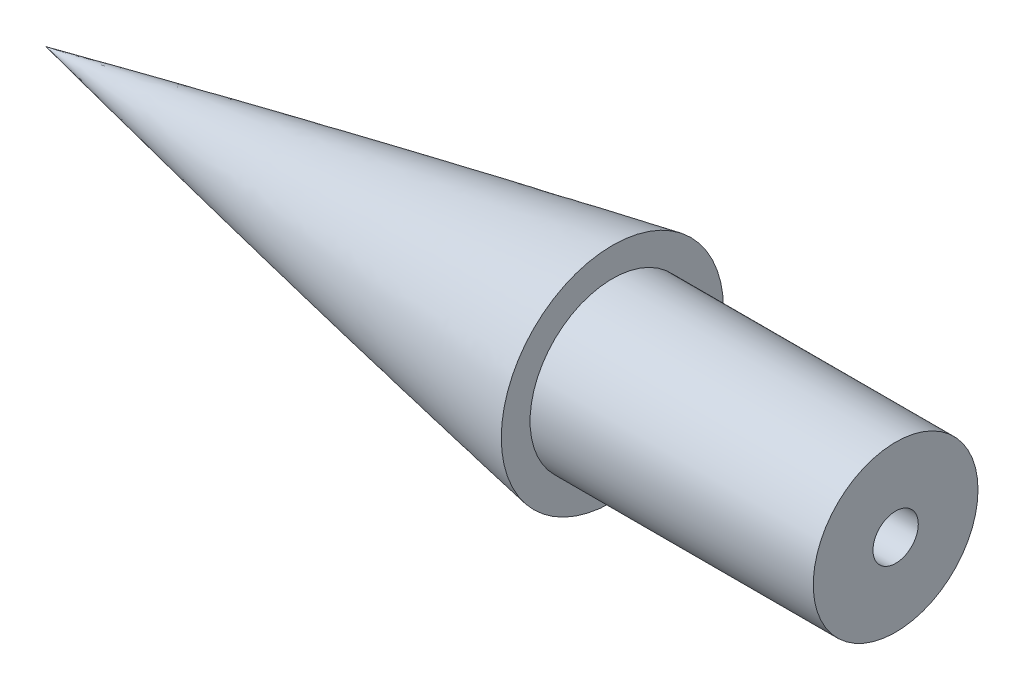
ISO-10303-21;
HEADER;
FILE_DESCRIPTION(('STEP AP214'),'2;1');
FILE_NAME('part.step','',(''),(''),'','','');
FILE_SCHEMA(('AUTOMOTIVE_DESIGN { 1 0 10303 214 1 1 1 1 }'));
ENDSEC;
DATA;
#1=APPLICATION_CONTEXT('core data for automotive mechanical design processes');
#2=APPLICATION_PROTOCOL_DEFINITION('international standard','automotive_design',2000,#1);
#3=PRODUCT_CONTEXT('',#1,'mechanical');
#4=PRODUCT('Part','Part','',(#3));
#5=PRODUCT_RELATED_PRODUCT_CATEGORY('part','',(#4));
#6=PRODUCT_DEFINITION_FORMATION('','',#4);
#7=PRODUCT_DEFINITION_CONTEXT('part definition',#1,'design');
#8=PRODUCT_DEFINITION('design','',#6,#7);
#9=PRODUCT_DEFINITION_SHAPE('','',#8);
#10=(LENGTH_UNIT() NAMED_UNIT(*) SI_UNIT(.MILLI.,.METRE.));
#11=(NAMED_UNIT(*) PLANE_ANGLE_UNIT() SI_UNIT($,.RADIAN.));
#12=(NAMED_UNIT(*) SI_UNIT($,.STERADIAN.) SOLID_ANGLE_UNIT());
#13=UNCERTAINTY_MEASURE_WITH_UNIT(LENGTH_MEASURE(1.E-05),#10,'distance_accuracy_value','');
#14=(GEOMETRIC_REPRESENTATION_CONTEXT(3) GLOBAL_UNCERTAINTY_ASSIGNED_CONTEXT((#13)) GLOBAL_UNIT_ASSIGNED_CONTEXT((#10,
#11,#12)) REPRESENTATION_CONTEXT('',''));
#15=CARTESIAN_POINT('',(0.,0.,0.));
#16=DIRECTION('',(0.,0.,1.));
#17=DIRECTION('',(1.,0.,0.));
#18=AXIS2_PLACEMENT_3D('',#15,#16,#17);
#19=CARTESIAN_POINT('',(0.,3557.29676158737,0.));
#20=DIRECTION('',(1.,0.,0.));
#21=DIRECTION('',(0.,0.,-1.));
#22=AXIS2_PLACEMENT_3D('',#19,#20,#21);
#23=CYLINDRICAL_SURFACE('',#22,14.5417356015258);
#24=CARTESIAN_POINT('',(-599.999999999507,3557.29676158737,0.));
#25=DIRECTION('',(1.,0.,0.));
#26=DIRECTION('',(0.,0.,-1.));
#27=AXIS2_PLACEMENT_3D('',#24,#25,#26);
#28=CIRCLE('',#27,14.5417356015258);
#29=CARTESIAN_POINT('',(-599.999999999507,3557.29676158737,-14.5417356015258));
#30=VERTEX_POINT('',#29);
#31=EDGE_CURVE('E63',#30,#30,#28,.T.);
#32=ORIENTED_EDGE('',*,*,#31,.F.);
#33=EDGE_LOOP('',(#32));
#34=FACE_BOUND('',#33,.T.);
#35=CARTESIAN_POINT('',(-649.999999999507,3557.29676158737,0.));
#36=DIRECTION('',(1.,0.,0.));
#37=DIRECTION('',(0.,0.,-1.));
#38=AXIS2_PLACEMENT_3D('',#35,#36,#37);
#39=CIRCLE('',#38,14.5417356015258);
#40=CARTESIAN_POINT('',(-649.999999999507,3557.29676158737,-14.5417356015258));
#41=VERTEX_POINT('',#40);
#42=EDGE_CURVE('E11',#41,#41,#39,.T.);
#43=ORIENTED_EDGE('',*,*,#42,.T.);
#44=EDGE_LOOP('',(#43));
#45=FACE_BOUND('',#44,.T.);
#46=ADVANCED_FACE('F43',(#34,#45),#23,.T.);
#47=CARTESIAN_POINT('',(-649.999999999507,0.,0.));
#48=DIRECTION('',(-1.,0.,0.));
#49=DIRECTION('',(0.,0.,1.));
#50=AXIS2_PLACEMENT_3D('',#47,#48,#49);
#51=PLANE('',#50);
#52=ORIENTED_EDGE('',*,*,#42,.F.);
#53=EDGE_LOOP('',(#52));
#54=FACE_BOUND('',#53,.T.);
#55=CARTESIAN_POINT('',(-649.999999999507,3557.29676158737,0.));
#56=DIRECTION('',(1.,0.,0.));
#57=DIRECTION('',(0.,0.,-1.));
#58=AXIS2_PLACEMENT_3D('',#55,#56,#57);
#59=CIRCLE('',#58,19.6237365507463);
#60=CARTESIAN_POINT('',(-649.999999999507,3557.29676158737,-19.6237365507463));
#61=VERTEX_POINT('',#60);
#62=EDGE_CURVE('E50',#61,#61,#59,.T.);
#63=ORIENTED_EDGE('',*,*,#62,.T.);
#64=EDGE_LOOP('',(#63));
#65=FACE_BOUND('',#64,.T.);
#66=ADVANCED_FACE('F57',(#54,#65),#51,.F.);
#67=CARTESIAN_POINT('',(0.,3557.29676158737,3557.29676158737));
#68=DIRECTION('',(0.,-1.,0.));
#69=DIRECTION('',(0.,0.,-1.));
#70=AXIS2_PLACEMENT_3D('',#67,#68,#69);
#71=CIRCLE('',#70,3635.5);
#72=TRIMMED_CURVE('',#71,(PARAMETER_VALUE(-0.207791074919299)),
(PARAMETER_VALUE(0.207791074919299)),.T.,.PARAMETER.);
#73=CARTESIAN_POINT('',(0.,3557.29676158737,0.));
#74=DIRECTION('',(1.,0.,0.));
#75=AXIS1_PLACEMENT('',#73,#74);
#76=SURFACE_OF_REVOLUTION('',#72,#75);
#77=CARTESIAN_POINT('',(-750.,3557.29676158737,0.));
#78=VERTEX_POINT('',#77);
#79=VERTEX_LOOP('',#78);
#80=FACE_BOUND('',#79,.T.);
#81=ORIENTED_EDGE('',*,*,#62,.F.);
#82=EDGE_LOOP('',(#81));
#83=FACE_BOUND('',#82,.T.);
#84=ADVANCED_FACE('F53',(#80,#83),#76,.T.);
#85=CARTESIAN_POINT('',(-599.999999999507,0.,0.));
#86=DIRECTION('',(-1.,0.,0.));
#87=DIRECTION('',(0.,0.,1.));
#88=AXIS2_PLACEMENT_3D('',#85,#86,#87);
#89=PLANE('',#88);
#90=CARTESIAN_POINT('',(-599.999999999507,3557.29676158737,0.));
#91=DIRECTION('',(1.,0.,0.));
#92=DIRECTION('',(0.,0.,-1.));
#93=AXIS2_PLACEMENT_3D('',#90,#91,#92);
#94=CIRCLE('',#93,4.);
#95=CARTESIAN_POINT('',(-599.999999999507,3557.29676158737,-4.));
#96=VERTEX_POINT('',#95);
#97=EDGE_CURVE('E69',#96,#96,#94,.T.);
#98=ORIENTED_EDGE('',*,*,#97,.F.);
#99=EDGE_LOOP('',(#98));
#100=FACE_BOUND('',#99,.T.);
#101=ORIENTED_EDGE('',*,*,#31,.T.);
#102=EDGE_LOOP('',(#101));
#103=FACE_BOUND('',#102,.T.);
#104=ADVANCED_FACE('F56',(#100,#103),#89,.F.);
#105=CARTESIAN_POINT('',(-639.999999999507,3557.29676158737,0.));
#106=DIRECTION('',(1.,0.,0.));
#107=DIRECTION('',(0.,0.,-1.));
#108=AXIS2_PLACEMENT_3D('',#105,#106,#107);
#109=CYLINDRICAL_SURFACE('',#108,4.);
#110=CARTESIAN_POINT('',(-639.999999999507,3557.29676158737,0.));
#111=DIRECTION('',(1.,0.,0.));
#112=DIRECTION('',(0.,0.,-1.));
#113=AXIS2_PLACEMENT_3D('',#110,#111,#112);
#114=CIRCLE('',#113,4.);
#115=CARTESIAN_POINT('',(-639.999999999507,3557.29676158737,-4.));
#116=VERTEX_POINT('',#115);
#117=EDGE_CURVE('E66',#116,#116,#114,.T.);
#118=ORIENTED_EDGE('',*,*,#117,.F.);
#119=EDGE_LOOP('',(#118));
#120=FACE_BOUND('',#119,.T.);
#121=ORIENTED_EDGE('',*,*,#97,.T.);
#122=EDGE_LOOP('',(#121));
#123=FACE_BOUND('',#122,.T.);
#124=ADVANCED_FACE('F79',(#120,#123),#109,.F.);
#125=CARTESIAN_POINT('',(-639.999999999507,3557.29676158737,0.));
#126=DIRECTION('',(1.,0.,0.));
#127=DIRECTION('',(0.,0.,-1.));
#128=AXIS2_PLACEMENT_3D('',#125,#126,#127);
#129=PLANE('',#128);
#130=ORIENTED_EDGE('',*,*,#117,.T.);
#131=EDGE_LOOP('',(#130));
#132=FACE_BOUND('',#131,.T.);
#133=ADVANCED_FACE('F77',(#132),#129,.T.);
#134=CLOSED_SHELL('',(#46,#66,#84,#104,#124,#133));
#135=MANIFOLD_SOLID_BREP('B2',#134);
#136=ADVANCED_BREP_SHAPE_REPRESENTATION('',(#18,#135),#14);
#137=SHAPE_DEFINITION_REPRESENTATION(#9,#136);
ENDSEC;
END-ISO-10303-21;
